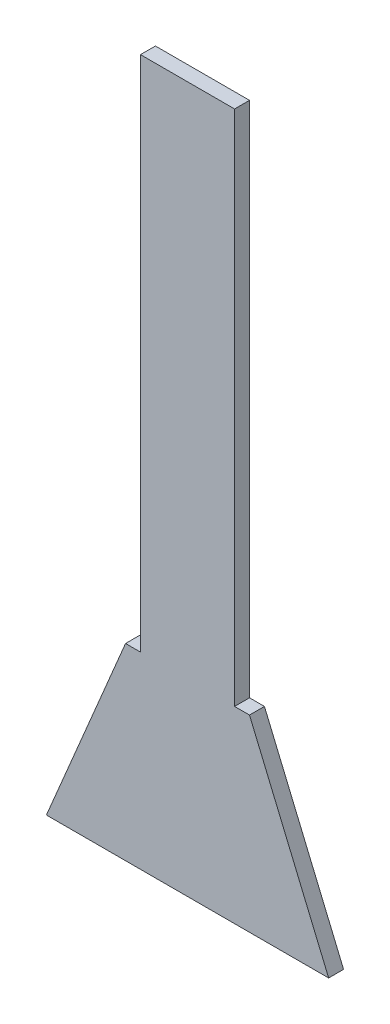
ISO-10303-21;
HEADER;
FILE_DESCRIPTION(('STEP AP214'),'2;1');
FILE_NAME('part.step','',(''),(''),'','','');
FILE_SCHEMA(('AUTOMOTIVE_DESIGN { 1 0 10303 214 1 1 1 1 }'));
ENDSEC;
DATA;
#1=APPLICATION_CONTEXT('core data for automotive mechanical design processes');
#2=APPLICATION_PROTOCOL_DEFINITION('international standard','automotive_design',2000,#1);
#3=PRODUCT_CONTEXT('',#1,'mechanical');
#4=PRODUCT('Part','Part','',(#3));
#5=PRODUCT_RELATED_PRODUCT_CATEGORY('part','',(#4));
#6=PRODUCT_DEFINITION_FORMATION('','',#4);
#7=PRODUCT_DEFINITION_CONTEXT('part definition',#1,'design');
#8=PRODUCT_DEFINITION('design','',#6,#7);
#9=PRODUCT_DEFINITION_SHAPE('','',#8);
#10=(LENGTH_UNIT() NAMED_UNIT(*) SI_UNIT(.MILLI.,.METRE.));
#11=(NAMED_UNIT(*) PLANE_ANGLE_UNIT() SI_UNIT($,.RADIAN.));
#12=(NAMED_UNIT(*) SI_UNIT($,.STERADIAN.) SOLID_ANGLE_UNIT());
#13=UNCERTAINTY_MEASURE_WITH_UNIT(LENGTH_MEASURE(1.E-05),#10,'distance_accuracy_value','');
#14=(GEOMETRIC_REPRESENTATION_CONTEXT(3) GLOBAL_UNCERTAINTY_ASSIGNED_CONTEXT((#13)) GLOBAL_UNIT_ASSIGNED_CONTEXT((#10,
#11,#12)) REPRESENTATION_CONTEXT('',''));
#15=CARTESIAN_POINT('',(0.,0.,0.));
#16=DIRECTION('',(0.,0.,1.));
#17=DIRECTION('',(1.,0.,0.));
#18=AXIS2_PLACEMENT_3D('',#15,#16,#17);
#19=CARTESIAN_POINT('',(-20.,300.,6.35));
#20=DIRECTION('',(1.,0.,0.));
#21=DIRECTION('',(0.,1.,0.));
#22=AXIS2_PLACEMENT_3D('',#19,#20,#21);
#23=PLANE('',#22);
#24=DIRECTION('',(0.,-1.,0.));
#25=VECTOR('',#24,1.);
#26=CARTESIAN_POINT('',(-20.,300.,0.));
#27=LINE('',#26,#25);
#28=CARTESIAN_POINT('',(-20.,300.,0.));
#29=VERTEX_POINT('',#28);
#30=CARTESIAN_POINT('',(-20.,80.,0.));
#31=VERTEX_POINT('',#30);
#32=EDGE_CURVE('E130',#29,#31,#27,.T.);
#33=ORIENTED_EDGE('',*,*,#32,.T.);
#34=DIRECTION('',(0.,0.,-1.));
#35=VECTOR('',#34,1.);
#36=CARTESIAN_POINT('',(-20.,80.,6.35));
#37=LINE('',#36,#35);
#38=CARTESIAN_POINT('',(-20.,80.,6.35));
#39=VERTEX_POINT('',#38);
#40=EDGE_CURVE('E11',#39,#31,#37,.T.);
#41=ORIENTED_EDGE('',*,*,#40,.F.);
#42=DIRECTION('',(0.,-1.,0.));
#43=VECTOR('',#42,1.);
#44=CARTESIAN_POINT('',(-20.,300.,6.35));
#45=LINE('',#44,#43);
#46=CARTESIAN_POINT('',(-20.,300.,6.35));
#47=VERTEX_POINT('',#46);
#48=EDGE_CURVE('E144',#47,#39,#45,.T.);
#49=ORIENTED_EDGE('',*,*,#48,.F.);
#50=DIRECTION('',(0.,0.,-1.));
#51=VECTOR('',#50,1.);
#52=CARTESIAN_POINT('',(-20.,300.,6.35));
#53=LINE('',#52,#51);
#54=EDGE_CURVE('E126',#47,#29,#53,.T.);
#55=ORIENTED_EDGE('',*,*,#54,.T.);
#56=EDGE_LOOP('',(#33,#41,#49,#55));
#57=FACE_BOUND('',#56,.T.);
#58=ADVANCED_FACE('F34',(#57),#23,.F.);
#59=CARTESIAN_POINT('',(-20.,80.,6.35));
#60=DIRECTION('',(0.,-1.,0.));
#61=DIRECTION('',(1.,0.,0.));
#62=AXIS2_PLACEMENT_3D('',#59,#60,#61);
#63=PLANE('',#62);
#64=DIRECTION('',(-1.,0.,0.));
#65=VECTOR('',#64,1.);
#66=CARTESIAN_POINT('',(-20.,80.,0.));
#67=LINE('',#66,#65);
#68=CARTESIAN_POINT('',(-26.35,80.,0.));
#69=VERTEX_POINT('',#68);
#70=EDGE_CURVE('E133',#31,#69,#67,.T.);
#71=ORIENTED_EDGE('',*,*,#70,.T.);
#72=DIRECTION('',(0.,0.,-1.));
#73=VECTOR('',#72,1.);
#74=CARTESIAN_POINT('',(-26.35,80.,6.35));
#75=LINE('',#74,#73);
#76=CARTESIAN_POINT('',(-26.35,80.,6.35));
#77=VERTEX_POINT('',#76);
#78=EDGE_CURVE('E42',#77,#69,#75,.T.);
#79=ORIENTED_EDGE('',*,*,#78,.F.);
#80=DIRECTION('',(-1.,0.,0.));
#81=VECTOR('',#80,1.);
#82=CARTESIAN_POINT('',(-20.,80.,6.35));
#83=LINE('',#82,#81);
#84=EDGE_CURVE('E93',#39,#77,#83,.T.);
#85=ORIENTED_EDGE('',*,*,#84,.F.);
#86=ORIENTED_EDGE('',*,*,#40,.T.);
#87=EDGE_LOOP('',(#71,#79,#85,#86));
#88=FACE_BOUND('',#87,.T.);
#89=ADVANCED_FACE('F179',(#88),#63,.F.);
#90=CARTESIAN_POINT('',(-26.35,80.,6.35));
#91=DIRECTION('',(0.921776291869761,-0.387722152767718,0.));
#92=DIRECTION('',(0.387722152767718,0.921776291869761,0.));
#93=AXIS2_PLACEMENT_3D('',#90,#91,#92);
#94=PLANE('',#93);
#95=DIRECTION('',(-0.387722152767718,-0.921776291869761,0.));
#96=VECTOR('',#95,1.);
#97=CARTESIAN_POINT('',(-26.35,80.,0.));
#98=LINE('',#97,#96);
#99=CARTESIAN_POINT('',(-60.,0.,0.));
#100=VERTEX_POINT('',#99);
#101=EDGE_CURVE('E135',#69,#100,#98,.T.);
#102=ORIENTED_EDGE('',*,*,#101,.T.);
#103=DIRECTION('',(0.,0.,-1.));
#104=VECTOR('',#103,1.);
#105=CARTESIAN_POINT('',(-60.,0.,6.35));
#106=LINE('',#105,#104);
#107=CARTESIAN_POINT('',(-60.,0.,6.35));
#108=VERTEX_POINT('',#107);
#109=EDGE_CURVE('E151',#108,#100,#106,.T.);
#110=ORIENTED_EDGE('',*,*,#109,.F.);
#111=DIRECTION('',(-0.387722152767718,-0.921776291869761,0.));
#112=VECTOR('',#111,1.);
#113=CARTESIAN_POINT('',(-26.35,80.,6.35));
#114=LINE('',#113,#112);
#115=EDGE_CURVE('E159',#77,#108,#114,.T.);
#116=ORIENTED_EDGE('',*,*,#115,.F.);
#117=ORIENTED_EDGE('',*,*,#78,.T.);
#118=EDGE_LOOP('',(#102,#110,#116,#117));
#119=FACE_BOUND('',#118,.T.);
#120=ADVANCED_FACE('F157',(#119),#94,.F.);
#121=CARTESIAN_POINT('',(-60.,0.,6.35));
#122=DIRECTION('',(0.,1.,0.));
#123=DIRECTION('',(-1.,0.,0.));
#124=AXIS2_PLACEMENT_3D('',#121,#122,#123);
#125=PLANE('',#124);
#126=DIRECTION('',(1.,0.,0.));
#127=VECTOR('',#126,1.);
#128=CARTESIAN_POINT('',(-60.,0.,0.));
#129=LINE('',#128,#127);
#130=CARTESIAN_POINT('',(60.,0.,0.));
#131=VERTEX_POINT('',#130);
#132=EDGE_CURVE('E137',#100,#131,#129,.T.);
#133=ORIENTED_EDGE('',*,*,#132,.T.);
#134=DIRECTION('',(0.,0.,-1.));
#135=VECTOR('',#134,1.);
#136=CARTESIAN_POINT('',(60.,0.,6.35));
#137=LINE('',#136,#135);
#138=CARTESIAN_POINT('',(60.,0.,6.35));
#139=VERTEX_POINT('',#138);
#140=EDGE_CURVE('E148',#139,#131,#137,.T.);
#141=ORIENTED_EDGE('',*,*,#140,.F.);
#142=DIRECTION('',(1.,0.,0.));
#143=VECTOR('',#142,1.);
#144=CARTESIAN_POINT('',(-60.,0.,6.35));
#145=LINE('',#144,#143);
#146=EDGE_CURVE('E171',#108,#139,#145,.T.);
#147=ORIENTED_EDGE('',*,*,#146,.F.);
#148=ORIENTED_EDGE('',*,*,#109,.T.);
#149=EDGE_LOOP('',(#133,#141,#147,#148));
#150=FACE_BOUND('',#149,.T.);
#151=ADVANCED_FACE('F167',(#150),#125,.F.);
#152=CARTESIAN_POINT('',(26.3499999999999,80.,6.35));
#153=DIRECTION('',(-0.92177629186976,-0.387722152767719,0.));
#154=DIRECTION('',(0.387722152767719,-0.92177629186976,0.));
#155=AXIS2_PLACEMENT_3D('',#152,#153,#154);
#156=PLANE('',#155);
#157=DIRECTION('',(-0.387722152767719,0.92177629186976,0.));
#158=VECTOR('',#157,1.);
#159=CARTESIAN_POINT('',(26.3499999999999,80.,0.));
#160=LINE('',#159,#158);
#161=CARTESIAN_POINT('',(26.3499999999999,80.,0.));
#162=VERTEX_POINT('',#161);
#163=EDGE_CURVE('E139',#131,#162,#160,.T.);
#164=ORIENTED_EDGE('',*,*,#163,.T.);
#165=DIRECTION('',(0.,0.,-1.));
#166=VECTOR('',#165,1.);
#167=CARTESIAN_POINT('',(26.3499999999999,80.,6.35));
#168=LINE('',#167,#166);
#169=CARTESIAN_POINT('',(26.3499999999999,80.,6.35));
#170=VERTEX_POINT('',#169);
#171=EDGE_CURVE('E121',#170,#162,#168,.T.);
#172=ORIENTED_EDGE('',*,*,#171,.F.);
#173=DIRECTION('',(-0.387722152767719,0.92177629186976,0.));
#174=VECTOR('',#173,1.);
#175=CARTESIAN_POINT('',(26.3499999999999,80.,6.35));
#176=LINE('',#175,#174);
#177=EDGE_CURVE('E112',#139,#170,#176,.T.);
#178=ORIENTED_EDGE('',*,*,#177,.F.);
#179=ORIENTED_EDGE('',*,*,#140,.T.);
#180=EDGE_LOOP('',(#164,#172,#178,#179));
#181=FACE_BOUND('',#180,.T.);
#182=ADVANCED_FACE('F170',(#181),#156,.F.);
#183=CARTESIAN_POINT('',(26.3499999999999,80.,6.35));
#184=DIRECTION('',(0.,-1.,0.));
#185=DIRECTION('',(1.,0.,0.));
#186=AXIS2_PLACEMENT_3D('',#183,#184,#185);
#187=PLANE('',#186);
#188=DIRECTION('',(-1.,0.,0.));
#189=VECTOR('',#188,1.);
#190=CARTESIAN_POINT('',(26.3499999999999,80.,0.));
#191=LINE('',#190,#189);
#192=CARTESIAN_POINT('',(19.9999999999999,80.,0.));
#193=VERTEX_POINT('',#192);
#194=EDGE_CURVE('E120',#162,#193,#191,.T.);
#195=ORIENTED_EDGE('',*,*,#194,.T.);
#196=DIRECTION('',(0.,0.,-1.));
#197=VECTOR('',#196,1.);
#198=CARTESIAN_POINT('',(19.9999999999999,80.,6.35));
#199=LINE('',#198,#197);
#200=CARTESIAN_POINT('',(19.9999999999999,80.,6.35));
#201=VERTEX_POINT('',#200);
#202=EDGE_CURVE('E117',#201,#193,#199,.T.);
#203=ORIENTED_EDGE('',*,*,#202,.F.);
#204=DIRECTION('',(-1.,0.,0.));
#205=VECTOR('',#204,1.);
#206=CARTESIAN_POINT('',(26.3499999999999,80.,6.35));
#207=LINE('',#206,#205);
#208=EDGE_CURVE('E106',#170,#201,#207,.T.);
#209=ORIENTED_EDGE('',*,*,#208,.F.);
#210=ORIENTED_EDGE('',*,*,#171,.T.);
#211=EDGE_LOOP('',(#195,#203,#209,#210));
#212=FACE_BOUND('',#211,.T.);
#213=ADVANCED_FACE('F118',(#212),#187,.F.);
#214=CARTESIAN_POINT('',(20.,300.,6.35));
#215=DIRECTION('',(-1.,0.,0.));
#216=DIRECTION('',(0.,-1.,0.));
#217=AXIS2_PLACEMENT_3D('',#214,#215,#216);
#218=PLANE('',#217);
#219=DIRECTION('',(0.,1.,0.));
#220=VECTOR('',#219,1.);
#221=CARTESIAN_POINT('',(20.,300.,0.));
#222=LINE('',#221,#220);
#223=CARTESIAN_POINT('',(20.,300.,0.));
#224=VERTEX_POINT('',#223);
#225=EDGE_CURVE('E79',#193,#224,#222,.T.);
#226=ORIENTED_EDGE('',*,*,#225,.T.);
#227=DIRECTION('',(0.,0.,-1.));
#228=VECTOR('',#227,1.);
#229=CARTESIAN_POINT('',(20.,300.,6.35));
#230=LINE('',#229,#228);
#231=CARTESIAN_POINT('',(20.,300.,6.35));
#232=VERTEX_POINT('',#231);
#233=EDGE_CURVE('E122',#232,#224,#230,.T.);
#234=ORIENTED_EDGE('',*,*,#233,.F.);
#235=DIRECTION('',(0.,1.,0.));
#236=VECTOR('',#235,1.);
#237=CARTESIAN_POINT('',(20.,300.,6.35));
#238=LINE('',#237,#236);
#239=EDGE_CURVE('E110',#201,#232,#238,.T.);
#240=ORIENTED_EDGE('',*,*,#239,.F.);
#241=ORIENTED_EDGE('',*,*,#202,.T.);
#242=EDGE_LOOP('',(#226,#234,#240,#241));
#243=FACE_BOUND('',#242,.T.);
#244=ADVANCED_FACE('F124',(#243),#218,.F.);
#245=CARTESIAN_POINT('',(-20.,300.,6.35));
#246=DIRECTION('',(0.,-1.,0.));
#247=DIRECTION('',(0.,0.,-1.));
#248=AXIS2_PLACEMENT_3D('',#245,#246,#247);
#249=PLANE('',#248);
#250=DIRECTION('',(-1.,0.,0.));
#251=VECTOR('',#250,1.);
#252=CARTESIAN_POINT('',(-20.,300.,0.));
#253=LINE('',#252,#251);
#254=EDGE_CURVE('E85',#224,#29,#253,.T.);
#255=ORIENTED_EDGE('',*,*,#254,.T.);
#256=ORIENTED_EDGE('',*,*,#54,.F.);
#257=DIRECTION('',(-1.,0.,0.));
#258=VECTOR('',#257,1.);
#259=CARTESIAN_POINT('',(-20.,300.,6.35));
#260=LINE('',#259,#258);
#261=EDGE_CURVE('E50',#232,#47,#260,.T.);
#262=ORIENTED_EDGE('',*,*,#261,.F.);
#263=ORIENTED_EDGE('',*,*,#233,.T.);
#264=EDGE_LOOP('',(#255,#256,#262,#263));
#265=FACE_BOUND('',#264,.T.);
#266=ADVANCED_FACE('F195',(#265),#249,.F.);
#267=CARTESIAN_POINT('',(0.,0.,6.35));
#268=DIRECTION('',(0.,0.,-1.));
#269=DIRECTION('',(-1.,0.,0.));
#270=AXIS2_PLACEMENT_3D('',#267,#268,#269);
#271=PLANE('',#270);
#272=ORIENTED_EDGE('',*,*,#48,.T.);
#273=ORIENTED_EDGE('',*,*,#84,.T.);
#274=ORIENTED_EDGE('',*,*,#115,.T.);
#275=ORIENTED_EDGE('',*,*,#146,.T.);
#276=ORIENTED_EDGE('',*,*,#177,.T.);
#277=ORIENTED_EDGE('',*,*,#208,.T.);
#278=ORIENTED_EDGE('',*,*,#239,.T.);
#279=ORIENTED_EDGE('',*,*,#261,.T.);
#280=EDGE_LOOP('',(#272,#273,#274,#275,#276,#277,#278,#279));
#281=FACE_BOUND('',#280,.T.);
#282=ADVANCED_FACE('F108',(#281),#271,.F.);
#283=CARTESIAN_POINT('',(0.,0.,0.));
#284=DIRECTION('',(0.,0.,-1.));
#285=DIRECTION('',(-1.,0.,0.));
#286=AXIS2_PLACEMENT_3D('',#283,#284,#285);
#287=PLANE('',#286);
#288=ORIENTED_EDGE('',*,*,#32,.F.);
#289=ORIENTED_EDGE('',*,*,#254,.F.);
#290=ORIENTED_EDGE('',*,*,#225,.F.);
#291=ORIENTED_EDGE('',*,*,#194,.F.);
#292=ORIENTED_EDGE('',*,*,#163,.F.);
#293=ORIENTED_EDGE('',*,*,#132,.F.);
#294=ORIENTED_EDGE('',*,*,#101,.F.);
#295=ORIENTED_EDGE('',*,*,#70,.F.);
#296=EDGE_LOOP('',(#288,#289,#290,#291,#292,#293,#294,#295));
#297=FACE_BOUND('',#296,.T.);
#298=ADVANCED_FACE('F163',(#297),#287,.T.);
#299=CLOSED_SHELL('',(#58,#89,#120,#151,#182,#213,#244,#266,#282,#298));
#300=MANIFOLD_SOLID_BREP('B2',#299);
#301=ADVANCED_BREP_SHAPE_REPRESENTATION('',(#18,#300),#14);
#302=SHAPE_DEFINITION_REPRESENTATION(#9,#301);
ENDSEC;
END-ISO-10303-21;
